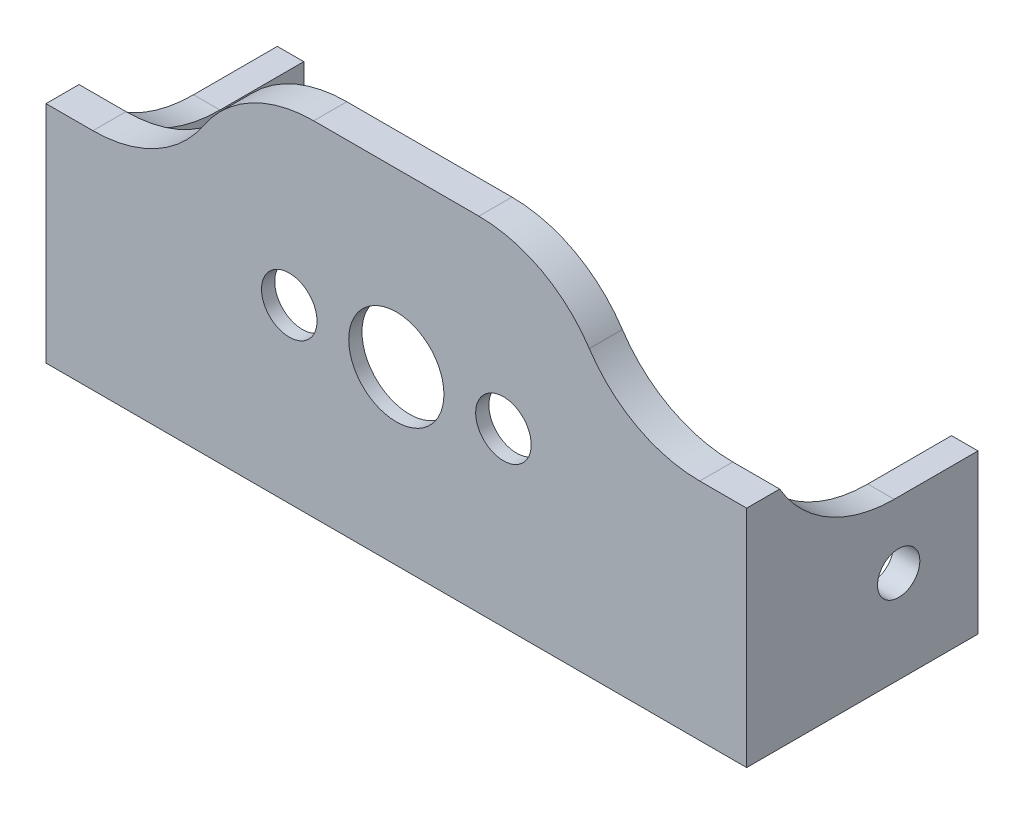
ISO-10303-21;
HEADER;
FILE_DESCRIPTION(('STEP AP214'),'2;1');
FILE_NAME('part.step','',(''),(''),'','','');
FILE_SCHEMA(('AUTOMOTIVE_DESIGN { 1 0 10303 214 1 1 1 1 }'));
ENDSEC;
DATA;
#1=APPLICATION_CONTEXT('core data for automotive mechanical design processes');
#2=APPLICATION_PROTOCOL_DEFINITION('international standard','automotive_design',2000,#1);
#3=PRODUCT_CONTEXT('',#1,'mechanical');
#4=PRODUCT('Part','Part','',(#3));
#5=PRODUCT_RELATED_PRODUCT_CATEGORY('part','',(#4));
#6=PRODUCT_DEFINITION_FORMATION('','',#4);
#7=PRODUCT_DEFINITION_CONTEXT('part definition',#1,'design');
#8=PRODUCT_DEFINITION('design','',#6,#7);
#9=PRODUCT_DEFINITION_SHAPE('','',#8);
#10=(LENGTH_UNIT() NAMED_UNIT(*) SI_UNIT(.MILLI.,.METRE.));
#11=(NAMED_UNIT(*) PLANE_ANGLE_UNIT() SI_UNIT($,.RADIAN.));
#12=(NAMED_UNIT(*) SI_UNIT($,.STERADIAN.) SOLID_ANGLE_UNIT());
#13=UNCERTAINTY_MEASURE_WITH_UNIT(LENGTH_MEASURE(1.E-05),#10,'distance_accuracy_value','');
#14=(GEOMETRIC_REPRESENTATION_CONTEXT(3) GLOBAL_UNCERTAINTY_ASSIGNED_CONTEXT((#13)) GLOBAL_UNIT_ASSIGNED_CONTEXT((#10,
#11,#12)) REPRESENTATION_CONTEXT('',''));
#15=CARTESIAN_POINT('',(0.,0.,0.));
#16=DIRECTION('',(0.,0.,1.));
#17=DIRECTION('',(1.,0.,0.));
#18=AXIS2_PLACEMENT_3D('',#15,#16,#17);
#19=CARTESIAN_POINT('',(0.,0.,0.));
#20=DIRECTION('',(0.,0.,1.));
#21=DIRECTION('',(1.,0.,0.));
#22=AXIS2_PLACEMENT_3D('',#19,#20,#21);
#23=PLANE('',#22);
#24=CARTESIAN_POINT('',(1.17133479212253,-1.85776805251641,0.));
#25=DIRECTION('',(0.,0.,-1.));
#26=DIRECTION('',(-1.,0.,0.));
#27=AXIS2_PLACEMENT_3D('',#24,#25,#26);
#28=CIRCLE('',#27,12.55);
#29=CARTESIAN_POINT('',(-11.3786652078775,-1.85776805251641,0.));
#30=VERTEX_POINT('',#29);
#31=EDGE_CURVE('E242',#30,#30,#28,.T.);
#32=ORIENTED_EDGE('',*,*,#31,.F.);
#33=EDGE_LOOP('',(#32));
#34=FACE_BOUND('',#33,.T.);
#35=DIRECTION('',(-1.,0.,0.));
#36=VECTOR('',#35,1.);
#37=CARTESIAN_POINT('',(-11.8286652078775,11.1422319474836,0.));
#38=LINE('',#37,#36);
#39=CARTESIAN_POINT('',(7.41791607469866,11.1422319474836,0.));
#40=VERTEX_POINT('',#39);
#41=CARTESIAN_POINT('',(-5.0752464904536,11.1422319474836,0.));
#42=VERTEX_POINT('',#41);
#43=EDGE_CURVE('E294',#40,#42,#38,.T.);
#44=ORIENTED_EDGE('',*,*,#43,.F.);
#45=CARTESIAN_POINT('',(7.41791607469867,1.14223194748359,0.));
#46=DIRECTION('',(0.,0.,1.));
#47=DIRECTION('',(1.,0.,0.));
#48=AXIS2_PLACEMENT_3D('',#45,#46,#47);
#49=CIRCLE('',#48,10.);
#50=CARTESIAN_POINT('',(15.7695626189437,6.64223194748359,0.));
#51=VERTEX_POINT('',#50);
#52=EDGE_CURVE('E363',#40,#51,#49,.F.);
#53=ORIENTED_EDGE('',*,*,#52,.T.);
#54=CARTESIAN_POINT('',(24.1212091631887,12.1422319474836,0.));
#55=DIRECTION('',(0.,0.,1.));
#56=DIRECTION('',(1.,0.,0.));
#57=AXIS2_PLACEMENT_3D('',#54,#55,#56);
#58=CIRCLE('',#57,10.);
#59=CARTESIAN_POINT('',(24.1212091631887,2.1422319474836,0.));
#60=VERTEX_POINT('',#59);
#61=EDGE_CURVE('E347',#51,#60,#58,.T.);
#62=ORIENTED_EDGE('',*,*,#61,.T.);
#63=DIRECTION('',(-1.,0.,0.));
#64=VECTOR('',#63,1.);
#65=CARTESIAN_POINT('',(14.1713347921225,2.14223194748359,0.));
#66=LINE('',#65,#64);
#67=CARTESIAN_POINT('',(25.6713347921225,2.1422319474836,0.));
#68=VERTEX_POINT('',#67);
#69=EDGE_CURVE('E266',#68,#60,#66,.T.);
#70=ORIENTED_EDGE('',*,*,#69,.F.);
#71=DIRECTION('',(0.,1.,0.));
#72=VECTOR('',#71,1.);
#73=CARTESIAN_POINT('',(25.6713347921225,-2.85776805251641,0.));
#74=LINE('',#73,#72);
#75=CARTESIAN_POINT('',(25.6713347921225,-14.8577680525164,0.));
#76=VERTEX_POINT('',#75);
#77=EDGE_CURVE('E205',#76,#68,#74,.T.);
#78=ORIENTED_EDGE('',*,*,#77,.F.);
#79=DIRECTION('',(1.,0.,0.));
#80=VECTOR('',#79,1.);
#81=CARTESIAN_POINT('',(-25.3286652078775,-14.8577680525164,0.));
#82=LINE('',#81,#80);
#83=CARTESIAN_POINT('',(-23.3286652078775,-14.8577680525164,0.));
#84=VERTEX_POINT('',#83);
#85=EDGE_CURVE('E275',#84,#76,#82,.T.);
#86=ORIENTED_EDGE('',*,*,#85,.F.);
#87=DIRECTION('',(0.,-1.,0.));
#88=VECTOR('',#87,1.);
#89=CARTESIAN_POINT('',(-23.3286652078775,-2.85776805251641,0.));
#90=LINE('',#89,#88);
#91=CARTESIAN_POINT('',(-23.3286652078775,2.14223194748359,0.));
#92=VERTEX_POINT('',#91);
#93=EDGE_CURVE('E199',#92,#84,#90,.T.);
#94=ORIENTED_EDGE('',*,*,#93,.F.);
#95=DIRECTION('',(-1.,0.,0.));
#96=VECTOR('',#95,1.);
#97=CARTESIAN_POINT('',(-11.8286652078775,2.14223194748359,0.));
#98=LINE('',#97,#96);
#99=CARTESIAN_POINT('',(-21.7785395789437,2.14223194748359,0.));
#100=VERTEX_POINT('',#99);
#101=EDGE_CURVE('E301',#100,#92,#98,.T.);
#102=ORIENTED_EDGE('',*,*,#101,.F.);
#103=CARTESIAN_POINT('',(-21.7785395789437,12.1422319474836,0.));
#104=DIRECTION('',(0.,0.,1.));
#105=DIRECTION('',(1.,0.,0.));
#106=AXIS2_PLACEMENT_3D('',#103,#104,#105);
#107=CIRCLE('',#106,10.);
#108=CARTESIAN_POINT('',(-13.4268930346986,6.64223194748359,0.));
#109=VERTEX_POINT('',#108);
#110=EDGE_CURVE('E340',#100,#109,#107,.T.);
#111=ORIENTED_EDGE('',*,*,#110,.T.);
#112=CARTESIAN_POINT('',(-5.0752464904536,1.14223194748359,0.));
#113=DIRECTION('',(0.,0.,1.));
#114=DIRECTION('',(1.,0.,0.));
#115=AXIS2_PLACEMENT_3D('',#112,#113,#114);
#116=CIRCLE('',#115,10.);
#117=EDGE_CURVE('E360',#109,#42,#116,.F.);
#118=ORIENTED_EDGE('',*,*,#117,.T.);
#119=EDGE_LOOP('',(#44,#53,#62,#70,#78,#86,#94,#102,#111,#118));
#120=FACE_BOUND('',#119,.T.);
#121=ADVANCED_FACE('F45',(#34,#120),#23,.F.);
#122=CARTESIAN_POINT('',(27.6713347921225,2.1422319474836,2.5));
#123=DIRECTION('',(-1.,0.,0.));
#124=DIRECTION('',(0.,-1.,0.));
#125=AXIS2_PLACEMENT_3D('',#122,#123,#124);
#126=PLANE('',#125);
#127=CARTESIAN_POINT('',(27.6713347921225,-7.8577680525164,-9.));
#128=DIRECTION('',(1.,0.,0.));
#129=DIRECTION('',(0.,0.,-1.));
#130=AXIS2_PLACEMENT_3D('',#127,#128,#129);
#131=CIRCLE('',#130,1.6);
#132=CARTESIAN_POINT('',(27.6713347921225,-7.8577680525164,-10.6));
#133=VERTEX_POINT('',#132);
#134=EDGE_CURVE('E443',#133,#133,#131,.T.);
#135=ORIENTED_EDGE('',*,*,#134,.F.);
#136=EDGE_LOOP('',(#135));
#137=FACE_BOUND('',#136,.T.);
#138=DIRECTION('',(0.,0.,-1.));
#139=VECTOR('',#138,1.);
#140=CARTESIAN_POINT('',(27.6713347921225,-14.8577680525164,2.5));
#141=LINE('',#140,#139);
#142=CARTESIAN_POINT('',(27.6713347921225,-14.8577680525164,2.5));
#143=VERTEX_POINT('',#142);
#144=CARTESIAN_POINT('',(27.6713347921225,-14.8577680525164,-15.));
#145=VERTEX_POINT('',#144);
#146=EDGE_CURVE('E181',#143,#145,#141,.T.);
#147=ORIENTED_EDGE('',*,*,#146,.T.);
#148=DIRECTION('',(0.,-1.,0.));
#149=VECTOR('',#148,1.);
#150=CARTESIAN_POINT('',(27.6713347921225,-2.85776805251641,-15.));
#151=LINE('',#150,#149);
#152=CARTESIAN_POINT('',(27.6713347921225,-2.85776805251641,-15.));
#153=VERTEX_POINT('',#152);
#154=EDGE_CURVE('E210',#153,#145,#151,.T.);
#155=ORIENTED_EDGE('',*,*,#154,.F.);
#156=DIRECTION('',(0.,0.,1.));
#157=VECTOR('',#156,1.);
#158=CARTESIAN_POINT('',(27.6713347921225,-2.85776805251641,-15.));
#159=LINE('',#158,#157);
#160=CARTESIAN_POINT('',(27.6713347921225,-2.85776805251641,-8.66025403784439));
#161=VERTEX_POINT('',#160);
#162=EDGE_CURVE('E223',#153,#161,#159,.T.);
#163=ORIENTED_EDGE('',*,*,#162,.T.);
#164=CARTESIAN_POINT('',(27.6713347921225,7.14223194748359,-8.66025403784439));
#165=DIRECTION('',(-1.,0.,0.));
#166=DIRECTION('',(0.,-1.,0.));
#167=AXIS2_PLACEMENT_3D('',#164,#165,#166);
#168=CIRCLE('',#167,10.);
#169=CARTESIAN_POINT('',(27.6713347921225,2.1422319474836,0.));
#170=VERTEX_POINT('',#169);
#171=EDGE_CURVE('E334',#161,#170,#168,.T.);
#172=ORIENTED_EDGE('',*,*,#171,.T.);
#173=DIRECTION('',(0.,0.,-1.));
#174=VECTOR('',#173,1.);
#175=CARTESIAN_POINT('',(27.6713347921225,2.1422319474836,2.5));
#176=LINE('',#175,#174);
#177=CARTESIAN_POINT('',(27.6713347921225,2.1422319474836,2.5));
#178=VERTEX_POINT('',#177);
#179=EDGE_CURVE('E308',#178,#170,#176,.T.);
#180=ORIENTED_EDGE('',*,*,#179,.F.);
#181=DIRECTION('',(0.,1.,0.));
#182=VECTOR('',#181,1.);
#183=CARTESIAN_POINT('',(27.6713347921225,2.1422319474836,2.5));
#184=LINE('',#183,#182);
#185=EDGE_CURVE('E270',#143,#178,#184,.T.);
#186=ORIENTED_EDGE('',*,*,#185,.F.);
#187=EDGE_LOOP('',(#147,#155,#163,#172,#180,#186));
#188=FACE_BOUND('',#187,.T.);
#189=ADVANCED_FACE('F391',(#137,#188),#126,.F.);
#190=CARTESIAN_POINT('',(14.1713347921225,2.14223194748359,2.5));
#191=DIRECTION('',(0.,-1.,0.));
#192=DIRECTION('',(1.,0.,0.));
#193=AXIS2_PLACEMENT_3D('',#190,#191,#192);
#194=PLANE('',#193);
#195=ORIENTED_EDGE('',*,*,#69,.T.);
#196=DIRECTION('',(0.,0.,1.));
#197=VECTOR('',#196,1.);
#198=CARTESIAN_POINT('',(24.1212091631887,2.1422319474836,2.5));
#199=LINE('',#198,#197);
#200=CARTESIAN_POINT('',(24.1212091631887,2.1422319474836,2.5));
#201=VERTEX_POINT('',#200);
#202=EDGE_CURVE('E324',#60,#201,#199,.T.);
#203=ORIENTED_EDGE('',*,*,#202,.T.);
#204=DIRECTION('',(-1.,0.,0.));
#205=VECTOR('',#204,1.);
#206=CARTESIAN_POINT('',(14.1713347921225,2.14223194748359,2.5));
#207=LINE('',#206,#205);
#208=EDGE_CURVE('E274',#178,#201,#207,.T.);
#209=ORIENTED_EDGE('',*,*,#208,.F.);
#210=ORIENTED_EDGE('',*,*,#179,.T.);
#211=EDGE_CURVE('E290',#170,#68,#66,.T.);
#212=ORIENTED_EDGE('',*,*,#211,.T.);
#213=EDGE_LOOP('',(#195,#203,#209,#210,#212));
#214=FACE_BOUND('',#213,.T.);
#215=ADVANCED_FACE('F387',(#214),#194,.F.);
#216=CARTESIAN_POINT('',(-11.8286652078775,11.1422319474836,2.5));
#217=DIRECTION('',(0.,-1.,0.));
#218=DIRECTION('',(1.,0.,0.));
#219=AXIS2_PLACEMENT_3D('',#216,#217,#218);
#220=PLANE('',#219);
#221=DIRECTION('',(-1.,0.,0.));
#222=VECTOR('',#221,1.);
#223=CARTESIAN_POINT('',(-11.8286652078775,11.1422319474836,2.5));
#224=LINE('',#223,#222);
#225=CARTESIAN_POINT('',(7.41791607469866,11.1422319474836,2.5));
#226=VERTEX_POINT('',#225);
#227=CARTESIAN_POINT('',(-5.0752464904536,11.1422319474836,2.5));
#228=VERTEX_POINT('',#227);
#229=EDGE_CURVE('E279',#226,#228,#224,.T.);
#230=ORIENTED_EDGE('',*,*,#229,.F.);
#231=DIRECTION('',(0.,0.,1.));
#232=VECTOR('',#231,1.);
#233=CARTESIAN_POINT('',(7.41791607469867,11.1422319474836,2.5));
#234=LINE('',#233,#232);
#235=EDGE_CURVE('E356',#226,#40,#234,.F.);
#236=ORIENTED_EDGE('',*,*,#235,.T.);
#237=ORIENTED_EDGE('',*,*,#43,.T.);
#238=DIRECTION('',(0.,0.,-1.));
#239=VECTOR('',#238,1.);
#240=CARTESIAN_POINT('',(-5.0752464904536,11.1422319474836,2.5));
#241=LINE('',#240,#239);
#242=EDGE_CURVE('E353',#42,#228,#241,.F.);
#243=ORIENTED_EDGE('',*,*,#242,.T.);
#244=EDGE_LOOP('',(#230,#236,#237,#243));
#245=FACE_BOUND('',#244,.T.);
#246=ADVANCED_FACE('F377',(#245),#220,.F.);
#247=CARTESIAN_POINT('',(-11.8286652078775,2.14223194748359,2.5));
#248=DIRECTION('',(0.,-1.,0.));
#249=DIRECTION('',(1.,0.,0.));
#250=AXIS2_PLACEMENT_3D('',#247,#248,#249);
#251=PLANE('',#250);
#252=DIRECTION('',(-1.,0.,0.));
#253=VECTOR('',#252,1.);
#254=CARTESIAN_POINT('',(-11.8286652078775,2.14223194748359,2.5));
#255=LINE('',#254,#253);
#256=CARTESIAN_POINT('',(-21.7785395789437,2.14223194748359,2.5));
#257=VERTEX_POINT('',#256);
#258=CARTESIAN_POINT('',(-25.3286652078775,2.14223194748359,2.5));
#259=VERTEX_POINT('',#258);
#260=EDGE_CURVE('E282',#257,#259,#255,.T.);
#261=ORIENTED_EDGE('',*,*,#260,.F.);
#262=DIRECTION('',(0.,0.,-1.));
#263=VECTOR('',#262,1.);
#264=CARTESIAN_POINT('',(-21.7785395789437,2.14223194748359,2.5));
#265=LINE('',#264,#263);
#266=EDGE_CURVE('E320',#257,#100,#265,.T.);
#267=ORIENTED_EDGE('',*,*,#266,.T.);
#268=ORIENTED_EDGE('',*,*,#101,.T.);
#269=CARTESIAN_POINT('',(-25.3286652078775,2.14223194748359,0.));
#270=VERTEX_POINT('',#269);
#271=EDGE_CURVE('E298',#92,#270,#98,.T.);
#272=ORIENTED_EDGE('',*,*,#271,.T.);
#273=DIRECTION('',(0.,0.,-1.));
#274=VECTOR('',#273,1.);
#275=CARTESIAN_POINT('',(-25.3286652078775,2.14223194748359,2.5));
#276=LINE('',#275,#274);
#277=EDGE_CURVE('E180',#259,#270,#276,.T.);
#278=ORIENTED_EDGE('',*,*,#277,.F.);
#279=EDGE_LOOP('',(#261,#267,#268,#272,#278));
#280=FACE_BOUND('',#279,.T.);
#281=ADVANCED_FACE('F419',(#280),#251,.F.);
#282=CARTESIAN_POINT('',(-25.3286652078775,2.14223194748359,2.5));
#283=DIRECTION('',(1.,0.,0.));
#284=DIRECTION('',(0.,1.,0.));
#285=AXIS2_PLACEMENT_3D('',#282,#283,#284);
#286=PLANE('',#285);
#287=CARTESIAN_POINT('',(-25.3286652078775,-7.8577680525164,-9.));
#288=DIRECTION('',(1.,0.,0.));
#289=DIRECTION('',(0.,0.,-1.));
#290=AXIS2_PLACEMENT_3D('',#287,#288,#289);
#291=CIRCLE('',#290,1.6);
#292=CARTESIAN_POINT('',(-25.3286652078775,-7.8577680525164,-10.6));
#293=VERTEX_POINT('',#292);
#294=EDGE_CURVE('E447',#293,#293,#291,.T.);
#295=ORIENTED_EDGE('',*,*,#294,.T.);
#296=EDGE_LOOP('',(#295));
#297=FACE_BOUND('',#296,.T.);
#298=ORIENTED_EDGE('',*,*,#277,.T.);
#299=CARTESIAN_POINT('',(-25.3286652078775,7.14223194748359,-8.66025403784439));
#300=DIRECTION('',(1.,0.,0.));
#301=DIRECTION('',(0.,1.,0.));
#302=AXIS2_PLACEMENT_3D('',#299,#300,#301);
#303=CIRCLE('',#302,10.);
#304=CARTESIAN_POINT('',(-25.3286652078775,-2.85776805251641,-8.66025403784439));
#305=VERTEX_POINT('',#304);
#306=EDGE_CURVE('E331',#270,#305,#303,.T.);
#307=ORIENTED_EDGE('',*,*,#306,.T.);
#308=DIRECTION('',(0.,0.,1.));
#309=VECTOR('',#308,1.);
#310=CARTESIAN_POINT('',(-25.3286652078775,-2.85776805251641,-15.));
#311=LINE('',#310,#309);
#312=CARTESIAN_POINT('',(-25.3286652078775,-2.85776805251641,-15.));
#313=VERTEX_POINT('',#312);
#314=EDGE_CURVE('E197',#313,#305,#311,.T.);
#315=ORIENTED_EDGE('',*,*,#314,.F.);
#316=DIRECTION('',(0.,1.,0.));
#317=VECTOR('',#316,1.);
#318=CARTESIAN_POINT('',(-25.3286652078775,-2.85776805251641,-15.));
#319=LINE('',#318,#317);
#320=CARTESIAN_POINT('',(-25.3286652078775,-14.8577680525164,-15.));
#321=VERTEX_POINT('',#320);
#322=EDGE_CURVE('E186',#321,#313,#319,.T.);
#323=ORIENTED_EDGE('',*,*,#322,.F.);
#324=DIRECTION('',(0.,0.,-1.));
#325=VECTOR('',#324,1.);
#326=CARTESIAN_POINT('',(-25.3286652078775,-14.8577680525164,2.5));
#327=LINE('',#326,#325);
#328=CARTESIAN_POINT('',(-25.3286652078775,-14.8577680525164,2.5));
#329=VERTEX_POINT('',#328);
#330=EDGE_CURVE('E170',#329,#321,#327,.T.);
#331=ORIENTED_EDGE('',*,*,#330,.F.);
#332=DIRECTION('',(0.,-1.,0.));
#333=VECTOR('',#332,1.);
#334=CARTESIAN_POINT('',(-25.3286652078775,2.14223194748359,2.5));
#335=LINE('',#334,#333);
#336=EDGE_CURVE('E285',#259,#329,#335,.T.);
#337=ORIENTED_EDGE('',*,*,#336,.F.);
#338=EDGE_LOOP('',(#298,#307,#315,#323,#331,#337));
#339=FACE_BOUND('',#338,.T.);
#340=ADVANCED_FACE('F195',(#297,#339),#286,.F.);
#341=CARTESIAN_POINT('',(-25.3286652078775,-14.8577680525164,2.5));
#342=DIRECTION('',(0.,1.,0.));
#343=DIRECTION('',(-1.,0.,0.));
#344=AXIS2_PLACEMENT_3D('',#341,#342,#343);
#345=PLANE('',#344);
#346=ORIENTED_EDGE('',*,*,#330,.T.);
#347=DIRECTION('',(-1.,0.,0.));
#348=VECTOR('',#347,1.);
#349=CARTESIAN_POINT('',(-25.3286652078775,-14.8577680525164,-15.));
#350=LINE('',#349,#348);
#351=CARTESIAN_POINT('',(-23.3286652078775,-14.8577680525164,-15.));
#352=VERTEX_POINT('',#351);
#353=EDGE_CURVE('E173',#352,#321,#350,.T.);
#354=ORIENTED_EDGE('',*,*,#353,.F.);
#355=DIRECTION('',(0.,0.,1.));
#356=VECTOR('',#355,1.);
#357=CARTESIAN_POINT('',(-23.3286652078775,-14.8577680525164,-15.));
#358=LINE('',#357,#356);
#359=EDGE_CURVE('E192',#352,#84,#358,.T.);
#360=ORIENTED_EDGE('',*,*,#359,.T.);
#361=ORIENTED_EDGE('',*,*,#85,.T.);
#362=DIRECTION('',(0.,0.,1.));
#363=VECTOR('',#362,1.);
#364=CARTESIAN_POINT('',(25.6713347921225,-14.8577680525164,-15.));
#365=LINE('',#364,#363);
#366=CARTESIAN_POINT('',(25.6713347921225,-14.8577680525164,-15.));
#367=VERTEX_POINT('',#366);
#368=EDGE_CURVE('E233',#367,#76,#365,.T.);
#369=ORIENTED_EDGE('',*,*,#368,.F.);
#370=DIRECTION('',(-1.,0.,0.));
#371=VECTOR('',#370,1.);
#372=CARTESIAN_POINT('',(27.6713347921225,-14.8577680525164,-15.));
#373=LINE('',#372,#371);
#374=EDGE_CURVE('E214',#145,#367,#373,.T.);
#375=ORIENTED_EDGE('',*,*,#374,.F.);
#376=ORIENTED_EDGE('',*,*,#146,.F.);
#377=DIRECTION('',(1.,0.,0.));
#378=VECTOR('',#377,1.);
#379=CARTESIAN_POINT('',(-25.3286652078775,-14.8577680525164,2.5));
#380=LINE('',#379,#378);
#381=EDGE_CURVE('E175',#329,#143,#380,.T.);
#382=ORIENTED_EDGE('',*,*,#381,.F.);
#383=EDGE_LOOP('',(#346,#354,#360,#361,#369,#375,#376,#382));
#384=FACE_BOUND('',#383,.T.);
#385=ADVANCED_FACE('F172',(#384),#345,.F.);
#386=CARTESIAN_POINT('',(0.,0.,2.5));
#387=DIRECTION('',(0.,0.,1.));
#388=DIRECTION('',(1.,0.,0.));
#389=AXIS2_PLACEMENT_3D('',#386,#387,#388);
#390=PLANE('',#389);
#391=CARTESIAN_POINT('',(9.27133479212253,-1.85776805251641,2.5));
#392=DIRECTION('',(0.,0.,1.));
#393=DIRECTION('',(1.,0.,0.));
#394=AXIS2_PLACEMENT_3D('',#391,#392,#393);
#395=CIRCLE('',#394,2.1);
#396=CARTESIAN_POINT('',(11.3713347921225,-1.85776805251641,2.5));
#397=VERTEX_POINT('',#396);
#398=EDGE_CURVE('E243',#397,#397,#395,.F.);
#399=ORIENTED_EDGE('',*,*,#398,.T.);
#400=EDGE_LOOP('',(#399));
#401=FACE_BOUND('',#400,.T.);
#402=CARTESIAN_POINT('',(-6.92866520787747,-1.85776805251641,2.5));
#403=DIRECTION('',(0.,0.,1.));
#404=DIRECTION('',(1.,0.,0.));
#405=AXIS2_PLACEMENT_3D('',#402,#403,#404);
#406=CIRCLE('',#405,2.1);
#407=CARTESIAN_POINT('',(-4.82866520787746,-1.85776805251641,2.5));
#408=VERTEX_POINT('',#407);
#409=EDGE_CURVE('E247',#408,#408,#406,.F.);
#410=ORIENTED_EDGE('',*,*,#409,.T.);
#411=EDGE_LOOP('',(#410));
#412=FACE_BOUND('',#411,.T.);
#413=CARTESIAN_POINT('',(1.17133479212253,-1.85776805251641,2.5));
#414=DIRECTION('',(0.,0.,1.));
#415=DIRECTION('',(1.,0.,0.));
#416=AXIS2_PLACEMENT_3D('',#413,#414,#415);
#417=CIRCLE('',#416,3.6);
#418=CARTESIAN_POINT('',(4.77133479212253,-1.85776805251641,2.5));
#419=VERTEX_POINT('',#418);
#420=EDGE_CURVE('E255',#419,#419,#417,.F.);
#421=ORIENTED_EDGE('',*,*,#420,.T.);
#422=EDGE_LOOP('',(#421));
#423=FACE_BOUND('',#422,.T.);
#424=CARTESIAN_POINT('',(24.1212091631887,12.1422319474836,2.5));
#425=DIRECTION('',(0.,0.,1.));
#426=DIRECTION('',(1.,0.,0.));
#427=AXIS2_PLACEMENT_3D('',#424,#425,#426);
#428=CIRCLE('',#427,10.);
#429=CARTESIAN_POINT('',(15.7695626189437,6.64223194748359,2.5));
#430=VERTEX_POINT('',#429);
#431=EDGE_CURVE('E350',#201,#430,#428,.F.);
#432=ORIENTED_EDGE('',*,*,#431,.T.);
#433=CARTESIAN_POINT('',(7.41791607469867,1.14223194748359,2.5));
#434=DIRECTION('',(0.,0.,1.));
#435=DIRECTION('',(1.,0.,0.));
#436=AXIS2_PLACEMENT_3D('',#433,#434,#435);
#437=CIRCLE('',#436,10.);
#438=EDGE_CURVE('E55',#430,#226,#437,.T.);
#439=ORIENTED_EDGE('',*,*,#438,.T.);
#440=ORIENTED_EDGE('',*,*,#229,.T.);
#441=CARTESIAN_POINT('',(-5.0752464904536,1.14223194748359,2.5));
#442=DIRECTION('',(0.,0.,1.));
#443=DIRECTION('',(1.,0.,0.));
#444=AXIS2_PLACEMENT_3D('',#441,#442,#443);
#445=CIRCLE('',#444,10.);
#446=CARTESIAN_POINT('',(-13.4268930346986,6.64223194748359,2.5));
#447=VERTEX_POINT('',#446);
#448=EDGE_CURVE('E62',#228,#447,#445,.T.);
#449=ORIENTED_EDGE('',*,*,#448,.T.);
#450=CARTESIAN_POINT('',(-21.7785395789437,12.1422319474836,2.5));
#451=DIRECTION('',(0.,0.,1.));
#452=DIRECTION('',(1.,0.,0.));
#453=AXIS2_PLACEMENT_3D('',#450,#451,#452);
#454=CIRCLE('',#453,10.);
#455=EDGE_CURVE('E344',#447,#257,#454,.F.);
#456=ORIENTED_EDGE('',*,*,#455,.T.);
#457=ORIENTED_EDGE('',*,*,#260,.T.);
#458=ORIENTED_EDGE('',*,*,#336,.T.);
#459=ORIENTED_EDGE('',*,*,#381,.T.);
#460=ORIENTED_EDGE('',*,*,#185,.T.);
#461=ORIENTED_EDGE('',*,*,#208,.T.);
#462=EDGE_LOOP('',(#432,#439,#440,#449,#456,#457,#458,#459,#460,#461));
#463=FACE_BOUND('',#462,.T.);
#464=ADVANCED_FACE('F373',(#401,#412,#423,#463),#390,.T.);
#465=CARTESIAN_POINT('',(1.17133479212253,-1.85776805251641,1.5));
#466=DIRECTION('',(0.,0.,-1.));
#467=DIRECTION('',(-1.,0.,0.));
#468=AXIS2_PLACEMENT_3D('',#465,#466,#467);
#469=CYLINDRICAL_SURFACE('',#468,12.55);
#470=CARTESIAN_POINT('',(1.17133479212253,-1.85776805251641,1.5));
#471=DIRECTION('',(0.,0.,-1.));
#472=DIRECTION('',(-1.,0.,0.));
#473=AXIS2_PLACEMENT_3D('',#470,#471,#472);
#474=CIRCLE('',#473,12.55);
#475=CARTESIAN_POINT('',(-11.3786652078775,-1.85776805251641,1.5));
#476=VERTEX_POINT('',#475);
#477=EDGE_CURVE('E262',#476,#476,#474,.T.);
#478=ORIENTED_EDGE('',*,*,#477,.F.);
#479=EDGE_LOOP('',(#478));
#480=FACE_BOUND('',#479,.T.);
#481=ORIENTED_EDGE('',*,*,#31,.T.);
#482=EDGE_LOOP('',(#481));
#483=FACE_BOUND('',#482,.T.);
#484=ADVANCED_FACE('F667',(#480,#483),#469,.F.);
#485=CARTESIAN_POINT('',(1.17133479212253,-1.85776805251641,1.5));
#486=DIRECTION('',(0.,0.,-1.));
#487=DIRECTION('',(-1.,0.,0.));
#488=AXIS2_PLACEMENT_3D('',#485,#486,#487);
#489=PLANE('',#488);
#490=CARTESIAN_POINT('',(1.17133479212253,-1.85776805251641,1.5));
#491=DIRECTION('',(0.,0.,-1.));
#492=DIRECTION('',(-1.,0.,0.));
#493=AXIS2_PLACEMENT_3D('',#490,#491,#492);
#494=CIRCLE('',#493,3.6);
#495=CARTESIAN_POINT('',(-2.42866520787747,-1.85776805251641,1.5));
#496=VERTEX_POINT('',#495);
#497=EDGE_CURVE('E237',#496,#496,#494,.T.);
#498=ORIENTED_EDGE('',*,*,#497,.F.);
#499=EDGE_LOOP('',(#498));
#500=FACE_BOUND('',#499,.T.);
#501=CARTESIAN_POINT('',(9.27133479212253,-1.85776805251641,1.5));
#502=DIRECTION('',(0.,0.,-1.));
#503=DIRECTION('',(-1.,0.,0.));
#504=AXIS2_PLACEMENT_3D('',#501,#502,#503);
#505=CIRCLE('',#504,2.1);
#506=CARTESIAN_POINT('',(7.17133479212253,-1.85776805251641,1.5));
#507=VERTEX_POINT('',#506);
#508=EDGE_CURVE('E238',#507,#507,#505,.T.);
#509=ORIENTED_EDGE('',*,*,#508,.F.);
#510=EDGE_LOOP('',(#509));
#511=FACE_BOUND('',#510,.T.);
#512=CARTESIAN_POINT('',(-6.92866520787747,-1.85776805251641,1.5));
#513=DIRECTION('',(0.,0.,-1.));
#514=DIRECTION('',(1.,0.,0.));
#515=AXIS2_PLACEMENT_3D('',#512,#513,#514);
#516=CIRCLE('',#515,2.1);
#517=CARTESIAN_POINT('',(-4.82866520787746,-1.85776805251641,1.5));
#518=VERTEX_POINT('',#517);
#519=EDGE_CURVE('E251',#518,#518,#516,.T.);
#520=ORIENTED_EDGE('',*,*,#519,.F.);
#521=EDGE_LOOP('',(#520));
#522=FACE_BOUND('',#521,.T.);
#523=ORIENTED_EDGE('',*,*,#477,.T.);
#524=EDGE_LOOP('',(#523));
#525=FACE_BOUND('',#524,.T.);
#526=ADVANCED_FACE('F657',(#500,#511,#522,#525),#489,.T.);
#527=CARTESIAN_POINT('',(-6.92866520787747,-1.85776805251641,2.501));
#528=DIRECTION('',(0.,0.,-1.));
#529=DIRECTION('',(-1.,0.,0.));
#530=AXIS2_PLACEMENT_3D('',#527,#528,#529);
#531=CYLINDRICAL_SURFACE('',#530,2.1);
#532=ORIENTED_EDGE('',*,*,#409,.F.);
#533=EDGE_LOOP('',(#532));
#534=FACE_BOUND('',#533,.T.);
#535=ORIENTED_EDGE('',*,*,#519,.T.);
#536=EDGE_LOOP('',(#535));
#537=FACE_BOUND('',#536,.T.);
#538=ADVANCED_FACE('F647',(#534,#537),#531,.F.);
#539=CARTESIAN_POINT('',(9.27133479212253,-1.85776805251641,2.501));
#540=DIRECTION('',(0.,0.,-1.));
#541=DIRECTION('',(-1.,0.,0.));
#542=AXIS2_PLACEMENT_3D('',#539,#540,#541);
#543=CYLINDRICAL_SURFACE('',#542,2.1);
#544=ORIENTED_EDGE('',*,*,#398,.F.);
#545=EDGE_LOOP('',(#544));
#546=FACE_BOUND('',#545,.T.);
#547=ORIENTED_EDGE('',*,*,#508,.T.);
#548=EDGE_LOOP('',(#547));
#549=FACE_BOUND('',#548,.T.);
#550=ADVANCED_FACE('F637',(#546,#549),#543,.F.);
#551=CARTESIAN_POINT('',(1.17133479212253,-1.85776805251641,2.501));
#552=DIRECTION('',(0.,0.,-1.));
#553=DIRECTION('',(-1.,0.,0.));
#554=AXIS2_PLACEMENT_3D('',#551,#552,#553);
#555=CYLINDRICAL_SURFACE('',#554,3.6);
#556=ORIENTED_EDGE('',*,*,#420,.F.);
#557=EDGE_LOOP('',(#556));
#558=FACE_BOUND('',#557,.T.);
#559=ORIENTED_EDGE('',*,*,#497,.T.);
#560=EDGE_LOOP('',(#559));
#561=FACE_BOUND('',#560,.T.);
#562=ADVANCED_FACE('F538',(#558,#561),#555,.F.);
#563=CARTESIAN_POINT('',(25.6713347921225,-2.85776805251641,-15.));
#564=DIRECTION('',(1.,0.,0.));
#565=DIRECTION('',(0.,0.,-1.));
#566=AXIS2_PLACEMENT_3D('',#563,#564,#565);
#567=PLANE('',#566);
#568=CARTESIAN_POINT('',(25.6713347921225,-7.8577680525164,-9.));
#569=DIRECTION('',(1.,0.,0.));
#570=DIRECTION('',(0.,0.,-1.));
#571=AXIS2_PLACEMENT_3D('',#568,#569,#570);
#572=CIRCLE('',#571,1.6);
#573=CARTESIAN_POINT('',(25.6713347921225,-7.8577680525164,-10.6));
#574=VERTEX_POINT('',#573);
#575=EDGE_CURVE('E432',#574,#574,#572,.T.);
#576=ORIENTED_EDGE('',*,*,#575,.T.);
#577=EDGE_LOOP('',(#576));
#578=FACE_BOUND('',#577,.T.);
#579=ORIENTED_EDGE('',*,*,#77,.T.);
#580=CARTESIAN_POINT('',(25.6713347921225,7.14223194748359,-8.66025403784439));
#581=DIRECTION('',(1.,0.,0.));
#582=DIRECTION('',(0.,0.,-1.));
#583=AXIS2_PLACEMENT_3D('',#580,#581,#582);
#584=CIRCLE('',#583,10.);
#585=CARTESIAN_POINT('',(25.6713347921225,-2.85776805251641,-8.66025403784439));
#586=VERTEX_POINT('',#585);
#587=EDGE_CURVE('E337',#68,#586,#584,.T.);
#588=ORIENTED_EDGE('',*,*,#587,.T.);
#589=DIRECTION('',(0.,0.,1.));
#590=VECTOR('',#589,1.);
#591=CARTESIAN_POINT('',(25.6713347921225,-2.85776805251641,-15.));
#592=LINE('',#591,#590);
#593=CARTESIAN_POINT('',(25.6713347921225,-2.85776805251641,-15.));
#594=VERTEX_POINT('',#593);
#595=EDGE_CURVE('E229',#594,#586,#592,.T.);
#596=ORIENTED_EDGE('',*,*,#595,.F.);
#597=DIRECTION('',(0.,1.,0.));
#598=VECTOR('',#597,1.);
#599=CARTESIAN_POINT('',(25.6713347921225,-2.85776805251641,-15.));
#600=LINE('',#599,#598);
#601=EDGE_CURVE('E217',#367,#594,#600,.T.);
#602=ORIENTED_EDGE('',*,*,#601,.F.);
#603=ORIENTED_EDGE('',*,*,#368,.T.);
#604=EDGE_LOOP('',(#579,#588,#596,#602,#603));
#605=FACE_BOUND('',#604,.T.);
#606=ADVANCED_FACE('F399',(#578,#605),#567,.F.);
#607=CARTESIAN_POINT('',(27.6713347921225,-2.85776805251641,-15.));
#608=DIRECTION('',(0.,-1.,0.));
#609=DIRECTION('',(0.,0.,-1.));
#610=AXIS2_PLACEMENT_3D('',#607,#608,#609);
#611=PLANE('',#610);
#612=ORIENTED_EDGE('',*,*,#595,.T.);
#613=DIRECTION('',(1.,0.,0.));
#614=VECTOR('',#613,1.);
#615=CARTESIAN_POINT('',(27.6713347921225,-2.85776805251641,-8.66025403784439));
#616=LINE('',#615,#614);
#617=EDGE_CURVE('E316',#586,#161,#616,.T.);
#618=ORIENTED_EDGE('',*,*,#617,.T.);
#619=ORIENTED_EDGE('',*,*,#162,.F.);
#620=DIRECTION('',(1.,0.,0.));
#621=VECTOR('',#620,1.);
#622=CARTESIAN_POINT('',(27.6713347921225,-2.85776805251641,-15.));
#623=LINE('',#622,#621);
#624=EDGE_CURVE('E220',#594,#153,#623,.T.);
#625=ORIENTED_EDGE('',*,*,#624,.F.);
#626=EDGE_LOOP('',(#612,#618,#619,#625));
#627=FACE_BOUND('',#626,.T.);
#628=ADVANCED_FACE('F404',(#627),#611,.F.);
#629=CARTESIAN_POINT('',(0.,0.,-15.));
#630=DIRECTION('',(0.,0.,-1.));
#631=DIRECTION('',(-1.,0.,0.));
#632=AXIS2_PLACEMENT_3D('',#629,#630,#631);
#633=PLANE('',#632);
#634=ORIENTED_EDGE('',*,*,#154,.T.);
#635=ORIENTED_EDGE('',*,*,#374,.T.);
#636=ORIENTED_EDGE('',*,*,#601,.T.);
#637=ORIENTED_EDGE('',*,*,#624,.T.);
#638=EDGE_LOOP('',(#634,#635,#636,#637));
#639=FACE_BOUND('',#638,.T.);
#640=ADVANCED_FACE('F408',(#639),#633,.T.);
#641=CARTESIAN_POINT('',(-25.3286652078775,-2.85776805251641,-15.));
#642=DIRECTION('',(0.,-1.,0.));
#643=DIRECTION('',(1.,0.,0.));
#644=AXIS2_PLACEMENT_3D('',#641,#642,#643);
#645=PLANE('',#644);
#646=ORIENTED_EDGE('',*,*,#314,.T.);
#647=DIRECTION('',(1.,0.,0.));
#648=VECTOR('',#647,1.);
#649=CARTESIAN_POINT('',(-25.3286652078775,-2.85776805251641,-8.66025403784439));
#650=LINE('',#649,#648);
#651=CARTESIAN_POINT('',(-23.3286652078775,-2.85776805251641,-8.66025403784439));
#652=VERTEX_POINT('',#651);
#653=EDGE_CURVE('E312',#305,#652,#650,.T.);
#654=ORIENTED_EDGE('',*,*,#653,.T.);
#655=DIRECTION('',(0.,0.,1.));
#656=VECTOR('',#655,1.);
#657=CARTESIAN_POINT('',(-23.3286652078775,-2.85776805251641,-15.));
#658=LINE('',#657,#656);
#659=CARTESIAN_POINT('',(-23.3286652078775,-2.85776805251641,-15.));
#660=VERTEX_POINT('',#659);
#661=EDGE_CURVE('E431',#660,#652,#658,.T.);
#662=ORIENTED_EDGE('',*,*,#661,.F.);
#663=DIRECTION('',(1.,0.,0.));
#664=VECTOR('',#663,1.);
#665=CARTESIAN_POINT('',(-25.3286652078775,-2.85776805251641,-15.));
#666=LINE('',#665,#664);
#667=EDGE_CURVE('E200',#313,#660,#666,.T.);
#668=ORIENTED_EDGE('',*,*,#667,.F.);
#669=EDGE_LOOP('',(#646,#654,#662,#668));
#670=FACE_BOUND('',#669,.T.);
#671=ADVANCED_FACE('F427',(#670),#645,.F.);
#672=CARTESIAN_POINT('',(-23.3286652078775,-2.85776805251641,-15.));
#673=DIRECTION('',(-1.,0.,0.));
#674=DIRECTION('',(0.,-1.,0.));
#675=AXIS2_PLACEMENT_3D('',#672,#673,#674);
#676=PLANE('',#675);
#677=CARTESIAN_POINT('',(-23.3286652078775,-7.8577680525164,-9.));
#678=DIRECTION('',(-1.,0.,0.));
#679=DIRECTION('',(0.,-1.,0.));
#680=AXIS2_PLACEMENT_3D('',#677,#678,#679);
#681=CIRCLE('',#680,1.6);
#682=CARTESIAN_POINT('',(-23.3286652078775,-9.45776805251641,-9.));
#683=VERTEX_POINT('',#682);
#684=EDGE_CURVE('E49',#683,#683,#681,.T.);
#685=ORIENTED_EDGE('',*,*,#684,.T.);
#686=EDGE_LOOP('',(#685));
#687=FACE_BOUND('',#686,.T.);
#688=ORIENTED_EDGE('',*,*,#93,.T.);
#689=ORIENTED_EDGE('',*,*,#359,.F.);
#690=DIRECTION('',(0.,-1.,0.));
#691=VECTOR('',#690,1.);
#692=CARTESIAN_POINT('',(-23.3286652078775,-2.85776805251641,-15.));
#693=LINE('',#692,#691);
#694=EDGE_CURVE('E189',#660,#352,#693,.T.);
#695=ORIENTED_EDGE('',*,*,#694,.F.);
#696=ORIENTED_EDGE('',*,*,#661,.T.);
#697=CARTESIAN_POINT('',(-23.3286652078775,7.14223194748359,-8.66025403784439));
#698=DIRECTION('',(-1.,0.,0.));
#699=DIRECTION('',(0.,-1.,0.));
#700=AXIS2_PLACEMENT_3D('',#697,#698,#699);
#701=CIRCLE('',#700,10.);
#702=EDGE_CURVE('E327',#652,#92,#701,.T.);
#703=ORIENTED_EDGE('',*,*,#702,.T.);
#704=EDGE_LOOP('',(#688,#689,#695,#696,#703));
#705=FACE_BOUND('',#704,.T.);
#706=ADVANCED_FACE('F456',(#687,#705),#676,.F.);
#707=CARTESIAN_POINT('',(0.,0.,-15.));
#708=DIRECTION('',(0.,0.,1.));
#709=DIRECTION('',(1.,0.,0.));
#710=AXIS2_PLACEMENT_3D('',#707,#708,#709);
#711=PLANE('',#710);
#712=ORIENTED_EDGE('',*,*,#322,.T.);
#713=ORIENTED_EDGE('',*,*,#667,.T.);
#714=ORIENTED_EDGE('',*,*,#694,.T.);
#715=ORIENTED_EDGE('',*,*,#353,.T.);
#716=EDGE_LOOP('',(#712,#713,#714,#715));
#717=FACE_BOUND('',#716,.T.);
#718=ADVANCED_FACE('F185',(#717),#711,.F.);
#719=CARTESIAN_POINT('',(0.,7.14223194748359,-8.66025403784439));
#720=DIRECTION('',(1.,0.,0.));
#721=DIRECTION('',(0.,1.,0.));
#722=AXIS2_PLACEMENT_3D('',#719,#720,#721);
#723=CYLINDRICAL_SURFACE('',#722,10.);
#724=ORIENTED_EDGE('',*,*,#306,.F.);
#725=ORIENTED_EDGE('',*,*,#271,.F.);
#726=ORIENTED_EDGE('',*,*,#702,.F.);
#727=ORIENTED_EDGE('',*,*,#653,.F.);
#728=EDGE_LOOP('',(#724,#725,#726,#727));
#729=FACE_BOUND('',#728,.T.);
#730=ADVANCED_FACE('F424',(#729),#723,.F.);
#731=CARTESIAN_POINT('',(0.,7.14223194748359,-8.66025403784439));
#732=DIRECTION('',(1.,0.,0.));
#733=DIRECTION('',(0.,1.,0.));
#734=AXIS2_PLACEMENT_3D('',#731,#732,#733);
#735=CYLINDRICAL_SURFACE('',#734,10.);
#736=ORIENTED_EDGE('',*,*,#587,.F.);
#737=ORIENTED_EDGE('',*,*,#211,.F.);
#738=ORIENTED_EDGE('',*,*,#171,.F.);
#739=ORIENTED_EDGE('',*,*,#617,.F.);
#740=EDGE_LOOP('',(#736,#737,#738,#739));
#741=FACE_BOUND('',#740,.T.);
#742=ADVANCED_FACE('F395',(#741),#735,.F.);
#743=CARTESIAN_POINT('',(-21.7785395789437,12.1422319474836,2.5));
#744=DIRECTION('',(0.,0.,-1.));
#745=DIRECTION('',(-1.,0.,0.));
#746=AXIS2_PLACEMENT_3D('',#743,#744,#745);
#747=CYLINDRICAL_SURFACE('',#746,10.);
#748=ORIENTED_EDGE('',*,*,#455,.F.);
#749=DIRECTION('',(0.,0.,-1.));
#750=VECTOR('',#749,1.);
#751=CARTESIAN_POINT('',(-13.4268930346986,6.64223194748359,2.5));
#752=LINE('',#751,#750);
#753=EDGE_CURVE('E11',#447,#109,#752,.T.);
#754=ORIENTED_EDGE('',*,*,#753,.T.);
#755=ORIENTED_EDGE('',*,*,#110,.F.);
#756=ORIENTED_EDGE('',*,*,#266,.F.);
#757=EDGE_LOOP('',(#748,#754,#755,#756));
#758=FACE_BOUND('',#757,.T.);
#759=ADVANCED_FACE('F497',(#758),#747,.F.);
#760=CARTESIAN_POINT('',(24.1212091631887,12.1422319474836,2.5));
#761=DIRECTION('',(0.,0.,1.));
#762=DIRECTION('',(1.,0.,0.));
#763=AXIS2_PLACEMENT_3D('',#760,#761,#762);
#764=CYLINDRICAL_SURFACE('',#763,10.);
#765=ORIENTED_EDGE('',*,*,#61,.F.);
#766=DIRECTION('',(0.,0.,1.));
#767=VECTOR('',#766,1.);
#768=CARTESIAN_POINT('',(15.7695626189437,6.64223194748359,2.5));
#769=LINE('',#768,#767);
#770=EDGE_CURVE('E70',#51,#430,#769,.T.);
#771=ORIENTED_EDGE('',*,*,#770,.T.);
#772=ORIENTED_EDGE('',*,*,#431,.F.);
#773=ORIENTED_EDGE('',*,*,#202,.F.);
#774=EDGE_LOOP('',(#765,#771,#772,#773));
#775=FACE_BOUND('',#774,.T.);
#776=ADVANCED_FACE('F385',(#775),#764,.F.);
#777=CARTESIAN_POINT('',(7.41791607469867,1.14223194748359,2.5));
#778=DIRECTION('',(0.,0.,1.));
#779=DIRECTION('',(1.,0.,0.));
#780=AXIS2_PLACEMENT_3D('',#777,#778,#779);
#781=CYLINDRICAL_SURFACE('',#780,10.);
#782=ORIENTED_EDGE('',*,*,#438,.F.);
#783=ORIENTED_EDGE('',*,*,#770,.F.);
#784=ORIENTED_EDGE('',*,*,#52,.F.);
#785=ORIENTED_EDGE('',*,*,#235,.F.);
#786=EDGE_LOOP('',(#782,#783,#784,#785));
#787=FACE_BOUND('',#786,.T.);
#788=ADVANCED_FACE('F380',(#787),#781,.T.);
#789=CARTESIAN_POINT('',(-5.0752464904536,1.14223194748359,2.5));
#790=DIRECTION('',(0.,0.,-1.));
#791=DIRECTION('',(-1.,0.,0.));
#792=AXIS2_PLACEMENT_3D('',#789,#790,#791);
#793=CYLINDRICAL_SURFACE('',#792,10.);
#794=ORIENTED_EDGE('',*,*,#448,.F.);
#795=ORIENTED_EDGE('',*,*,#242,.F.);
#796=ORIENTED_EDGE('',*,*,#117,.F.);
#797=ORIENTED_EDGE('',*,*,#753,.F.);
#798=EDGE_LOOP('',(#794,#795,#796,#797));
#799=FACE_BOUND('',#798,.T.);
#800=ADVANCED_FACE('F47',(#799),#793,.T.);
#801=CARTESIAN_POINT('',(-25.3286652078775,-7.8577680525164,-9.));
#802=DIRECTION('',(1.,0.,0.));
#803=DIRECTION('',(0.,0.,-1.));
#804=AXIS2_PLACEMENT_3D('',#801,#802,#803);
#805=CYLINDRICAL_SURFACE('',#804,1.6);
#806=ORIENTED_EDGE('',*,*,#294,.F.);
#807=EDGE_LOOP('',(#806));
#808=FACE_BOUND('',#807,.T.);
#809=ORIENTED_EDGE('',*,*,#684,.F.);
#810=EDGE_LOOP('',(#809));
#811=FACE_BOUND('',#810,.T.);
#812=ADVANCED_FACE('F459',(#808,#811),#805,.F.);
#813=ORIENTED_EDGE('',*,*,#134,.T.);
#814=EDGE_LOOP('',(#813));
#815=FACE_BOUND('',#814,.T.);
#816=ORIENTED_EDGE('',*,*,#575,.F.);
#817=EDGE_LOOP('',(#816));
#818=FACE_BOUND('',#817,.T.);
#819=ADVANCED_FACE('F461',(#815,#818),#805,.F.);
#820=CLOSED_SHELL('',(#121,#189,#215,#246,#281,#340,#385,#464,#484,#526,#538,#550,#562,#606,
#628,#640,#671,#706,#718,#730,#742,#759,#776,#788,#800,#812,#819));
#821=MANIFOLD_SOLID_BREP('B2',#820);
#822=ADVANCED_BREP_SHAPE_REPRESENTATION('',(#18,#821),#14);
#823=SHAPE_DEFINITION_REPRESENTATION(#9,#822);
ENDSEC;
END-ISO-10303-21;
